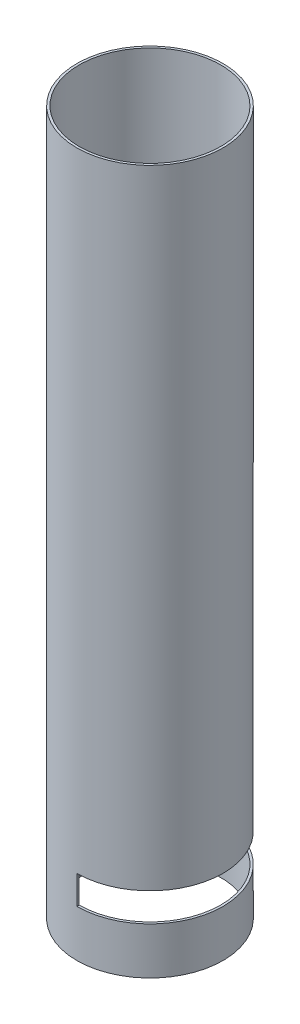
ISO-10303-21;
HEADER;
FILE_DESCRIPTION(('STEP AP214'),'2;1');
FILE_NAME('part.step','',(''),(''),'','','');
FILE_SCHEMA(('AUTOMOTIVE_DESIGN { 1 0 10303 214 1 1 1 1 }'));
ENDSEC;
DATA;
#1=APPLICATION_CONTEXT('core data for automotive mechanical design processes');
#2=APPLICATION_PROTOCOL_DEFINITION('international standard','automotive_design',2000,#1);
#3=PRODUCT_CONTEXT('',#1,'mechanical');
#4=PRODUCT('Part','Part','',(#3));
#5=PRODUCT_RELATED_PRODUCT_CATEGORY('part','',(#4));
#6=PRODUCT_DEFINITION_FORMATION('','',#4);
#7=PRODUCT_DEFINITION_CONTEXT('part definition',#1,'design');
#8=PRODUCT_DEFINITION('design','',#6,#7);
#9=PRODUCT_DEFINITION_SHAPE('','',#8);
#10=(LENGTH_UNIT() NAMED_UNIT(*) SI_UNIT(.MILLI.,.METRE.));
#11=(NAMED_UNIT(*) PLANE_ANGLE_UNIT() SI_UNIT($,.RADIAN.));
#12=(NAMED_UNIT(*) SI_UNIT($,.STERADIAN.) SOLID_ANGLE_UNIT());
#13=UNCERTAINTY_MEASURE_WITH_UNIT(LENGTH_MEASURE(1.E-05),#10,'distance_accuracy_value','');
#14=(GEOMETRIC_REPRESENTATION_CONTEXT(3) GLOBAL_UNCERTAINTY_ASSIGNED_CONTEXT((#13)) GLOBAL_UNIT_ASSIGNED_CONTEXT((#10,
#11,#12)) REPRESENTATION_CONTEXT('',''));
#15=CARTESIAN_POINT('',(0.,0.,0.));
#16=DIRECTION('',(0.,0.,1.));
#17=DIRECTION('',(1.,0.,0.));
#18=AXIS2_PLACEMENT_3D('',#15,#16,#17);
#19=CARTESIAN_POINT('',(0.,150.,0.));
#20=DIRECTION('',(0.,1.,0.));
#21=DIRECTION('',(0.,0.,1.));
#22=AXIS2_PLACEMENT_3D('',#19,#20,#21);
#23=PLANE('',#22);
#24=CARTESIAN_POINT('',(0.,150.,0.));
#25=DIRECTION('',(0.,1.,0.));
#26=DIRECTION('',(0.,0.,1.));
#27=AXIS2_PLACEMENT_3D('',#24,#25,#26);
#28=CIRCLE('',#27,31.165);
#29=CARTESIAN_POINT('',(0.,150.,31.165));
#30=VERTEX_POINT('',#29);
#31=EDGE_CURVE('E103',#30,#30,#28,.T.);
#32=ORIENTED_EDGE('',*,*,#31,.T.);
#33=EDGE_LOOP('',(#32));
#34=FACE_BOUND('',#33,.T.);
#35=CARTESIAN_POINT('',(0.,150.,0.));
#36=DIRECTION('',(0.,1.,0.));
#37=DIRECTION('',(0.,0.,1.));
#38=AXIS2_PLACEMENT_3D('',#35,#36,#37);
#39=CIRCLE('',#38,30.1625);
#40=CARTESIAN_POINT('',(0.,150.,30.1625));
#41=VERTEX_POINT('',#40);
#42=EDGE_CURVE('E97',#41,#41,#39,.T.);
#43=ORIENTED_EDGE('',*,*,#42,.F.);
#44=EDGE_LOOP('',(#43));
#45=FACE_BOUND('',#44,.T.);
#46=ADVANCED_FACE('F33',(#34,#45),#23,.T.);
#47=CARTESIAN_POINT('',(0.,-150.,0.));
#48=DIRECTION('',(0.,1.,0.));
#49=DIRECTION('',(0.,0.,1.));
#50=AXIS2_PLACEMENT_3D('',#47,#48,#49);
#51=PLANE('',#50);
#52=CARTESIAN_POINT('',(0.,-150.,0.));
#53=DIRECTION('',(0.,1.,0.));
#54=DIRECTION('',(0.,0.,1.));
#55=AXIS2_PLACEMENT_3D('',#52,#53,#54);
#56=CIRCLE('',#55,31.165);
#57=CARTESIAN_POINT('',(0.,-150.,31.165));
#58=VERTEX_POINT('',#57);
#59=EDGE_CURVE('E100',#58,#58,#56,.T.);
#60=ORIENTED_EDGE('',*,*,#59,.F.);
#61=EDGE_LOOP('',(#60));
#62=FACE_BOUND('',#61,.T.);
#63=CARTESIAN_POINT('',(0.,-150.,0.));
#64=DIRECTION('',(0.,1.,0.));
#65=DIRECTION('',(0.,0.,1.));
#66=AXIS2_PLACEMENT_3D('',#63,#64,#65);
#67=CIRCLE('',#66,30.1625);
#68=CARTESIAN_POINT('',(0.,-150.,30.1625));
#69=VERTEX_POINT('',#68);
#70=EDGE_CURVE('E81',#69,#69,#67,.T.);
#71=ORIENTED_EDGE('',*,*,#70,.T.);
#72=EDGE_LOOP('',(#71));
#73=FACE_BOUND('',#72,.T.);
#74=ADVANCED_FACE('F130',(#62,#73),#51,.F.);
#75=CARTESIAN_POINT('',(0.,150.,0.));
#76=DIRECTION('',(0.,-1.,0.));
#77=DIRECTION('',(0.,0.,-1.));
#78=AXIS2_PLACEMENT_3D('',#75,#76,#77);
#79=CYLINDRICAL_SURFACE('',#78,31.165);
#80=DIRECTION('',(0.,-1.,0.));
#81=VECTOR('',#80,1.);
#82=CARTESIAN_POINT('',(0.,-117.8,31.165));
#83=LINE('',#82,#81);
#84=CARTESIAN_POINT('',(0.,-117.8,31.165));
#85=VERTEX_POINT('',#84);
#86=CARTESIAN_POINT('',(0.,-130.,31.165));
#87=VERTEX_POINT('',#86);
#88=EDGE_CURVE('E79',#85,#87,#83,.T.);
#89=ORIENTED_EDGE('',*,*,#88,.F.);
#90=CARTESIAN_POINT('',(0.,-117.8,0.));
#91=DIRECTION('',(0.,1.,0.));
#92=DIRECTION('',(0.,0.,1.));
#93=AXIS2_PLACEMENT_3D('',#90,#91,#92);
#94=CIRCLE('',#93,31.165);
#95=CARTESIAN_POINT('',(0.,-117.8,-31.165));
#96=VERTEX_POINT('',#95);
#97=EDGE_CURVE('E74',#85,#96,#94,.T.);
#98=ORIENTED_EDGE('',*,*,#97,.T.);
#99=DIRECTION('',(0.,-1.,0.));
#100=VECTOR('',#99,1.);
#101=CARTESIAN_POINT('',(0.,-117.8,-31.165));
#102=LINE('',#101,#100);
#103=CARTESIAN_POINT('',(0.,-130.,-31.165));
#104=VERTEX_POINT('',#103);
#105=EDGE_CURVE('E78',#96,#104,#102,.T.);
#106=ORIENTED_EDGE('',*,*,#105,.T.);
#107=CARTESIAN_POINT('',(0.,-130.,0.));
#108=DIRECTION('',(0.,1.,0.));
#109=DIRECTION('',(0.,0.,1.));
#110=AXIS2_PLACEMENT_3D('',#107,#108,#109);
#111=CIRCLE('',#110,31.165);
#112=EDGE_CURVE('E82',#87,#104,#111,.T.);
#113=ORIENTED_EDGE('',*,*,#112,.F.);
#114=EDGE_LOOP('',(#89,#98,#106,#113));
#115=FACE_BOUND('',#114,.T.);
#116=ORIENTED_EDGE('',*,*,#31,.F.);
#117=EDGE_LOOP('',(#116));
#118=FACE_BOUND('',#117,.T.);
#119=ORIENTED_EDGE('',*,*,#59,.T.);
#120=EDGE_LOOP('',(#119));
#121=FACE_BOUND('',#120,.T.);
#122=ADVANCED_FACE('F35',(#115,#118,#121),#79,.T.);
#123=CARTESIAN_POINT('',(0.,150.,0.));
#124=DIRECTION('',(0.,-1.,0.));
#125=DIRECTION('',(0.,0.,-1.));
#126=AXIS2_PLACEMENT_3D('',#123,#124,#125);
#127=CYLINDRICAL_SURFACE('',#126,30.1625);
#128=CARTESIAN_POINT('',(0.,-117.8,0.));
#129=DIRECTION('',(0.,1.,0.));
#130=DIRECTION('',(0.,0.,1.));
#131=AXIS2_PLACEMENT_3D('',#128,#129,#130);
#132=CIRCLE('',#131,30.1625);
#133=CARTESIAN_POINT('',(0.,-117.8,30.1625));
#134=VERTEX_POINT('',#133);
#135=CARTESIAN_POINT('',(0.,-117.8,-30.1625));
#136=VERTEX_POINT('',#135);
#137=EDGE_CURVE('E11',#134,#136,#132,.T.);
#138=ORIENTED_EDGE('',*,*,#137,.F.);
#139=DIRECTION('',(0.,-1.,0.));
#140=VECTOR('',#139,1.);
#141=CARTESIAN_POINT('',(0.,150.,30.1625));
#142=LINE('',#141,#140);
#143=CARTESIAN_POINT('',(0.,-130.,30.1625));
#144=VERTEX_POINT('',#143);
#145=EDGE_CURVE('E111',#144,#134,#142,.F.);
#146=ORIENTED_EDGE('',*,*,#145,.F.);
#147=CARTESIAN_POINT('',(0.,-130.,0.));
#148=DIRECTION('',(0.,1.,0.));
#149=DIRECTION('',(0.,0.,1.));
#150=AXIS2_PLACEMENT_3D('',#147,#148,#149);
#151=CIRCLE('',#150,30.1625);
#152=CARTESIAN_POINT('',(0.,-130.,-30.1625));
#153=VERTEX_POINT('',#152);
#154=EDGE_CURVE('E106',#144,#153,#151,.T.);
#155=ORIENTED_EDGE('',*,*,#154,.T.);
#156=DIRECTION('',(0.,-1.,0.));
#157=VECTOR('',#156,1.);
#158=CARTESIAN_POINT('',(0.,150.,-30.1625));
#159=LINE('',#158,#157);
#160=EDGE_CURVE('E41',#136,#153,#159,.T.);
#161=ORIENTED_EDGE('',*,*,#160,.F.);
#162=EDGE_LOOP('',(#138,#146,#155,#161));
#163=FACE_BOUND('',#162,.T.);
#164=ORIENTED_EDGE('',*,*,#42,.T.);
#165=EDGE_LOOP('',(#164));
#166=FACE_BOUND('',#165,.T.);
#167=ORIENTED_EDGE('',*,*,#70,.F.);
#168=EDGE_LOOP('',(#167));
#169=FACE_BOUND('',#168,.T.);
#170=ADVANCED_FACE('F114',(#163,#166,#169),#127,.F.);
#171=CARTESIAN_POINT('',(0.,-117.8,-31.165));
#172=DIRECTION('',(-1.,0.,0.));
#173=DIRECTION('',(0.,0.,1.));
#174=AXIS2_PLACEMENT_3D('',#171,#172,#173);
#175=PLANE('',#174);
#176=ORIENTED_EDGE('',*,*,#160,.T.);
#177=DIRECTION('',(0.,0.,-1.));
#178=VECTOR('',#177,1.);
#179=CARTESIAN_POINT('',(0.,-130.,-31.165));
#180=LINE('',#179,#178);
#181=EDGE_CURVE('E48',#153,#104,#180,.T.);
#182=ORIENTED_EDGE('',*,*,#181,.T.);
#183=ORIENTED_EDGE('',*,*,#105,.F.);
#184=DIRECTION('',(0.,0.,-1.));
#185=VECTOR('',#184,1.);
#186=CARTESIAN_POINT('',(0.,-117.8,-31.165));
#187=LINE('',#186,#185);
#188=EDGE_CURVE('E84',#136,#96,#187,.T.);
#189=ORIENTED_EDGE('',*,*,#188,.F.);
#190=EDGE_LOOP('',(#176,#182,#183,#189));
#191=FACE_BOUND('',#190,.T.);
#192=ADVANCED_FACE('F91',(#191),#175,.F.);
#193=CARTESIAN_POINT('',(0.,-117.8,0.));
#194=DIRECTION('',(0.,1.,0.));
#195=DIRECTION('',(0.,0.,1.));
#196=AXIS2_PLACEMENT_3D('',#193,#194,#195);
#197=PLANE('',#196);
#198=EDGE_CURVE('E88',#85,#134,#187,.T.);
#199=ORIENTED_EDGE('',*,*,#198,.T.);
#200=ORIENTED_EDGE('',*,*,#137,.T.);
#201=ORIENTED_EDGE('',*,*,#188,.T.);
#202=ORIENTED_EDGE('',*,*,#97,.F.);
#203=EDGE_LOOP('',(#199,#200,#201,#202));
#204=FACE_BOUND('',#203,.T.);
#205=ADVANCED_FACE('F85',(#204),#197,.F.);
#206=CARTESIAN_POINT('',(0.,-130.,0.));
#207=DIRECTION('',(0.,1.,0.));
#208=DIRECTION('',(0.,0.,1.));
#209=AXIS2_PLACEMENT_3D('',#206,#207,#208);
#210=PLANE('',#209);
#211=ORIENTED_EDGE('',*,*,#112,.T.);
#212=ORIENTED_EDGE('',*,*,#181,.F.);
#213=ORIENTED_EDGE('',*,*,#154,.F.);
#214=EDGE_CURVE('E89',#87,#144,#180,.T.);
#215=ORIENTED_EDGE('',*,*,#214,.F.);
#216=EDGE_LOOP('',(#211,#212,#213,#215));
#217=FACE_BOUND('',#216,.T.);
#218=ADVANCED_FACE('F118',(#217),#210,.T.);
#219=ORIENTED_EDGE('',*,*,#145,.T.);
#220=ORIENTED_EDGE('',*,*,#198,.F.);
#221=ORIENTED_EDGE('',*,*,#88,.T.);
#222=ORIENTED_EDGE('',*,*,#214,.T.);
#223=EDGE_LOOP('',(#219,#220,#221,#222));
#224=FACE_BOUND('',#223,.T.);
#225=ADVANCED_FACE('F120',(#224),#175,.F.);
#226=CLOSED_SHELL('',(#46,#74,#122,#170,#192,#205,#218,#225));
#227=MANIFOLD_SOLID_BREP('B2',#226);
#228=ADVANCED_BREP_SHAPE_REPRESENTATION('',(#18,#227),#14);
#229=SHAPE_DEFINITION_REPRESENTATION(#9,#228);
ENDSEC;
END-ISO-10303-21;
